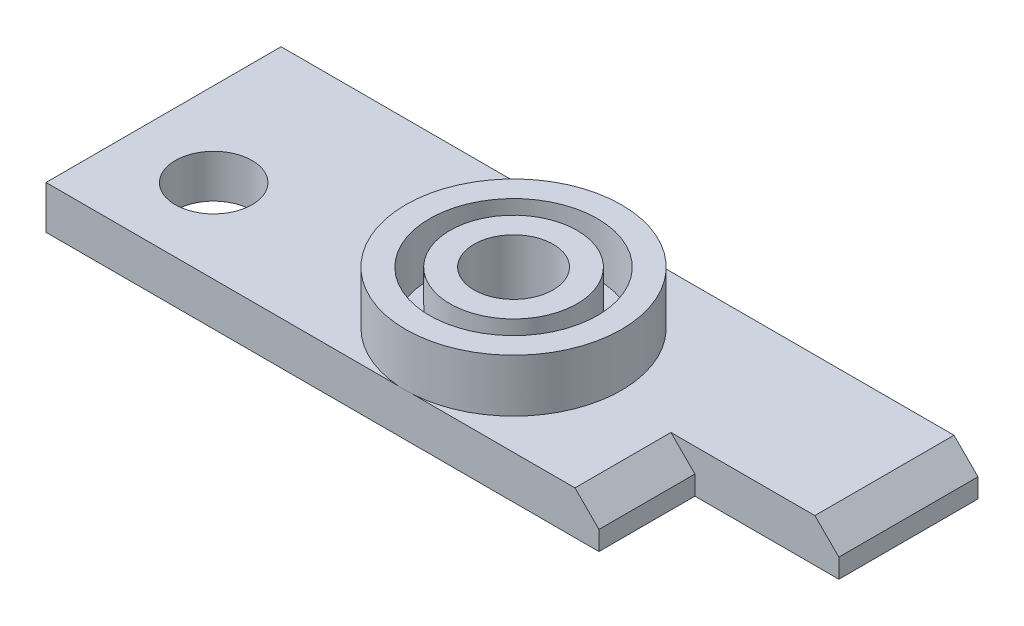
ISO-10303-21;
HEADER;
FILE_DESCRIPTION(('STEP AP214'),'2;1');
FILE_NAME('part.step','',(''),(''),'','','');
FILE_SCHEMA(('AUTOMOTIVE_DESIGN { 1 0 10303 214 1 1 1 1 }'));
ENDSEC;
DATA;
#1=APPLICATION_CONTEXT('core data for automotive mechanical design processes');
#2=APPLICATION_PROTOCOL_DEFINITION('international standard','automotive_design',2000,#1);
#3=PRODUCT_CONTEXT('',#1,'mechanical');
#4=PRODUCT('Part','Part','',(#3));
#5=PRODUCT_RELATED_PRODUCT_CATEGORY('part','',(#4));
#6=PRODUCT_DEFINITION_FORMATION('','',#4);
#7=PRODUCT_DEFINITION_CONTEXT('part definition',#1,'design');
#8=PRODUCT_DEFINITION('design','',#6,#7);
#9=PRODUCT_DEFINITION_SHAPE('','',#8);
#10=(LENGTH_UNIT() NAMED_UNIT(*) SI_UNIT(.MILLI.,.METRE.));
#11=(NAMED_UNIT(*) PLANE_ANGLE_UNIT() SI_UNIT($,.RADIAN.));
#12=(NAMED_UNIT(*) SI_UNIT($,.STERADIAN.) SOLID_ANGLE_UNIT());
#13=UNCERTAINTY_MEASURE_WITH_UNIT(LENGTH_MEASURE(1.E-05),#10,'distance_accuracy_value','');
#14=(GEOMETRIC_REPRESENTATION_CONTEXT(3) GLOBAL_UNCERTAINTY_ASSIGNED_CONTEXT((#13)) GLOBAL_UNIT_ASSIGNED_CONTEXT((#10,
#11,#12)) REPRESENTATION_CONTEXT('',''));
#15=CARTESIAN_POINT('',(0.,0.,0.));
#16=DIRECTION('',(0.,0.,1.));
#17=DIRECTION('',(1.,0.,0.));
#18=AXIS2_PLACEMENT_3D('',#15,#16,#17);
#19=CARTESIAN_POINT('',(0.,1.8,0.));
#20=DIRECTION('',(0.,1.,0.));
#21=DIRECTION('',(0.,0.,1.));
#22=AXIS2_PLACEMENT_3D('',#19,#20,#21);
#23=PLANE('',#22);
#24=CARTESIAN_POINT('',(14.9999999999999,1.8,-4.68975090072073));
#25=DIRECTION('',(0.,1.,0.));
#26=DIRECTION('',(0.,0.,1.));
#27=AXIS2_PLACEMENT_3D('',#24,#25,#26);
#28=CIRCLE('',#27,2.65000000000001);
#29=CARTESIAN_POINT('',(14.9999999999999,1.8,-2.03975090072073));
#30=VERTEX_POINT('',#29);
#31=EDGE_CURVE('E163',#30,#30,#28,.T.);
#32=ORIENTED_EDGE('',*,*,#31,.F.);
#33=EDGE_LOOP('',(#32));
#34=FACE_BOUND('',#33,.T.);
#35=CARTESIAN_POINT('',(14.9999999999999,1.8,-4.68975090072073));
#36=DIRECTION('',(0.,1.,0.));
#37=DIRECTION('',(0.,0.,1.));
#38=AXIS2_PLACEMENT_3D('',#35,#36,#37);
#39=CIRCLE('',#38,3.50000000000001);
#40=CARTESIAN_POINT('',(14.9999999999999,1.8,-1.18975090072073));
#41=VERTEX_POINT('',#40);
#42=EDGE_CURVE('E166',#41,#41,#39,.F.);
#43=ORIENTED_EDGE('',*,*,#42,.F.);
#44=EDGE_LOOP('',(#43));
#45=FACE_BOUND('',#44,.T.);
#46=ADVANCED_FACE('F43',(#34,#45),#23,.T.);
#47=CARTESIAN_POINT('',(29.05,1.8,-4.20000000000001));
#48=DIRECTION('',(0.,0.,-1.));
#49=DIRECTION('',(-1.,0.,0.));
#50=AXIS2_PLACEMENT_3D('',#47,#48,#49);
#51=PLANE('',#50);
#52=DIRECTION('',(0.,-1.,0.));
#53=VECTOR('',#52,1.);
#54=CARTESIAN_POINT('',(29.05,1.8,-4.20000000000001));
#55=LINE('',#54,#53);
#56=CARTESIAN_POINT('',(29.05,0.799999999999989,-4.20000000000001));
#57=VERTEX_POINT('',#56);
#58=CARTESIAN_POINT('',(29.05,0.,-4.20000000000001));
#59=VERTEX_POINT('',#58);
#60=EDGE_CURVE('E167',#57,#59,#55,.T.);
#61=ORIENTED_EDGE('',*,*,#60,.F.);
#62=DIRECTION('',(-0.707106781186545,0.70710678118655,0.));
#63=VECTOR('',#62,1.);
#64=CARTESIAN_POINT('',(28.05,1.8,-4.20000000000001));
#65=LINE('',#64,#63);
#66=CARTESIAN_POINT('',(28.05,1.8,-4.20000000000001));
#67=VERTEX_POINT('',#66);
#68=EDGE_CURVE('E52',#57,#67,#65,.T.);
#69=ORIENTED_EDGE('',*,*,#68,.T.);
#70=DIRECTION('',(1.,0.,0.));
#71=VECTOR('',#70,1.);
#72=CARTESIAN_POINT('',(29.05,1.8,-4.20000000000001));
#73=LINE('',#72,#71);
#74=CARTESIAN_POINT('',(22.05,1.8,-4.2));
#75=VERTEX_POINT('',#74);
#76=EDGE_CURVE('E149',#75,#67,#73,.T.);
#77=ORIENTED_EDGE('',*,*,#76,.F.);
#78=DIRECTION('',(0.707106781186545,-0.70710678118655,0.));
#79=VECTOR('',#78,1.);
#80=CARTESIAN_POINT('',(25.55,-1.7,-4.2));
#81=LINE('',#80,#79);
#82=CARTESIAN_POINT('',(23.05,0.799999999999989,-4.2));
#83=VERTEX_POINT('',#82);
#84=EDGE_CURVE('E11',#75,#83,#81,.T.);
#85=ORIENTED_EDGE('',*,*,#84,.T.);
#86=DIRECTION('',(0.,-1.,0.));
#87=VECTOR('',#86,1.);
#88=CARTESIAN_POINT('',(23.05,1.8,-4.2));
#89=LINE('',#88,#87);
#90=CARTESIAN_POINT('',(23.05,0.,-4.2));
#91=VERTEX_POINT('',#90);
#92=EDGE_CURVE('E141',#83,#91,#89,.T.);
#93=ORIENTED_EDGE('',*,*,#92,.T.);
#94=DIRECTION('',(1.,0.,0.));
#95=VECTOR('',#94,1.);
#96=CARTESIAN_POINT('',(29.05,0.,-4.20000000000001));
#97=LINE('',#96,#95);
#98=EDGE_CURVE('E162',#91,#59,#97,.T.);
#99=ORIENTED_EDGE('',*,*,#98,.T.);
#100=EDGE_LOOP('',(#61,#69,#77,#85,#93,#99));
#101=FACE_BOUND('',#100,.T.);
#102=ADVANCED_FACE('F198',(#101),#51,.F.);
#103=CARTESIAN_POINT('',(29.05,1.8,-4.20000000000001));
#104=DIRECTION('',(-1.,0.,0.));
#105=DIRECTION('',(0.,0.,1.));
#106=AXIS2_PLACEMENT_3D('',#103,#104,#105);
#107=PLANE('',#106);
#108=DIRECTION('',(0.,-1.,0.));
#109=VECTOR('',#108,1.);
#110=CARTESIAN_POINT('',(29.05,1.8,-10.));
#111=LINE('',#110,#109);
#112=CARTESIAN_POINT('',(29.05,0.799999999999989,-10.));
#113=VERTEX_POINT('',#112);
#114=CARTESIAN_POINT('',(29.05,0.,-10.));
#115=VERTEX_POINT('',#114);
#116=EDGE_CURVE('E258',#113,#115,#111,.T.);
#117=ORIENTED_EDGE('',*,*,#116,.F.);
#118=DIRECTION('',(0.,0.,1.));
#119=VECTOR('',#118,1.);
#120=CARTESIAN_POINT('',(29.05,0.799999999999989,-4.20000000000001));
#121=LINE('',#120,#119);
#122=EDGE_CURVE('E59',#113,#57,#121,.T.);
#123=ORIENTED_EDGE('',*,*,#122,.T.);
#124=ORIENTED_EDGE('',*,*,#60,.T.);
#125=DIRECTION('',(0.,0.,-1.));
#126=VECTOR('',#125,1.);
#127=CARTESIAN_POINT('',(29.05,0.,-4.20000000000001));
#128=LINE('',#127,#126);
#129=EDGE_CURVE('E240',#59,#115,#128,.T.);
#130=ORIENTED_EDGE('',*,*,#129,.T.);
#131=EDGE_LOOP('',(#117,#123,#124,#130));
#132=FACE_BOUND('',#131,.T.);
#133=ADVANCED_FACE('F205',(#132),#107,.F.);
#134=CARTESIAN_POINT('',(0.,1.8,-10.));
#135=DIRECTION('',(0.,0.,1.));
#136=DIRECTION('',(1.,0.,0.));
#137=AXIS2_PLACEMENT_3D('',#134,#135,#136);
#138=PLANE('',#137);
#139=DIRECTION('',(-1.,0.,0.));
#140=VECTOR('',#139,1.);
#141=CARTESIAN_POINT('',(0.,1.8,-10.));
#142=LINE('',#141,#140);
#143=CARTESIAN_POINT('',(28.05,1.8,-10.));
#144=VERTEX_POINT('',#143);
#145=CARTESIAN_POINT('',(0.,1.8,-10.));
#146=VERTEX_POINT('',#145);
#147=EDGE_CURVE('E148',#144,#146,#142,.T.);
#148=ORIENTED_EDGE('',*,*,#147,.F.);
#149=DIRECTION('',(0.707106781186545,-0.70710678118655,0.));
#150=VECTOR('',#149,1.);
#151=CARTESIAN_POINT('',(28.05,1.8,-10.));
#152=LINE('',#151,#150);
#153=EDGE_CURVE('E67',#144,#113,#152,.T.);
#154=ORIENTED_EDGE('',*,*,#153,.T.);
#155=ORIENTED_EDGE('',*,*,#116,.T.);
#156=DIRECTION('',(-1.,0.,0.));
#157=VECTOR('',#156,1.);
#158=CARTESIAN_POINT('',(0.,0.,-10.));
#159=LINE('',#158,#157);
#160=CARTESIAN_POINT('',(0.,0.,-10.));
#161=VERTEX_POINT('',#160);
#162=EDGE_CURVE('E241',#115,#161,#159,.T.);
#163=ORIENTED_EDGE('',*,*,#162,.T.);
#164=DIRECTION('',(0.,-1.,0.));
#165=VECTOR('',#164,1.);
#166=CARTESIAN_POINT('',(0.,1.8,-10.));
#167=LINE('',#166,#165);
#168=EDGE_CURVE('E255',#146,#161,#167,.T.);
#169=ORIENTED_EDGE('',*,*,#168,.F.);
#170=EDGE_LOOP('',(#148,#154,#155,#163,#169));
#171=FACE_BOUND('',#170,.T.);
#172=ADVANCED_FACE('F383',(#171),#138,.F.);
#173=CARTESIAN_POINT('',(0.,1.8,-4.2));
#174=DIRECTION('',(1.,0.,0.));
#175=DIRECTION('',(0.,0.,-1.));
#176=AXIS2_PLACEMENT_3D('',#173,#174,#175);
#177=PLANE('',#176);
#178=DIRECTION('',(0.,0.,1.));
#179=VECTOR('',#178,1.);
#180=CARTESIAN_POINT('',(0.,0.,-4.2));
#181=LINE('',#180,#179);
#182=CARTESIAN_POINT('',(0.,0.,-0.200000000000003));
#183=VERTEX_POINT('',#182);
#184=EDGE_CURVE('E246',#161,#183,#181,.T.);
#185=ORIENTED_EDGE('',*,*,#184,.T.);
#186=DIRECTION('',(0.,-1.,0.));
#187=VECTOR('',#186,1.);
#188=CARTESIAN_POINT('',(0.,1.8,-0.200000000000003));
#189=LINE('',#188,#187);
#190=CARTESIAN_POINT('',(0.,1.8,-0.200000000000003));
#191=VERTEX_POINT('',#190);
#192=EDGE_CURVE('E253',#191,#183,#189,.T.);
#193=ORIENTED_EDGE('',*,*,#192,.F.);
#194=DIRECTION('',(0.,0.,1.));
#195=VECTOR('',#194,1.);
#196=CARTESIAN_POINT('',(0.,1.8,-4.2));
#197=LINE('',#196,#195);
#198=EDGE_CURVE('E139',#146,#191,#197,.T.);
#199=ORIENTED_EDGE('',*,*,#198,.F.);
#200=ORIENTED_EDGE('',*,*,#168,.T.);
#201=EDGE_LOOP('',(#185,#193,#199,#200));
#202=FACE_BOUND('',#201,.T.);
#203=ADVANCED_FACE('F374',(#202),#177,.F.);
#204=CARTESIAN_POINT('',(0.,1.8,-0.200000000000003));
#205=DIRECTION('',(0.,0.,-1.));
#206=DIRECTION('',(-1.,0.,0.));
#207=AXIS2_PLACEMENT_3D('',#204,#205,#206);
#208=PLANE('',#207);
#209=DIRECTION('',(0.,-1.,0.));
#210=VECTOR('',#209,1.);
#211=CARTESIAN_POINT('',(23.05,1.8,-0.200000000000003));
#212=LINE('',#211,#210);
#213=CARTESIAN_POINT('',(23.05,0.799999999999989,-0.200000000000003));
#214=VERTEX_POINT('',#213);
#215=CARTESIAN_POINT('',(23.05,0.,-0.200000000000003));
#216=VERTEX_POINT('',#215);
#217=EDGE_CURVE('E142',#214,#216,#212,.T.);
#218=ORIENTED_EDGE('',*,*,#217,.F.);
#219=DIRECTION('',(-0.707106781186545,0.70710678118655,0.));
#220=VECTOR('',#219,1.);
#221=CARTESIAN_POINT('',(22.05,1.8,-0.200000000000003));
#222=LINE('',#221,#220);
#223=CARTESIAN_POINT('',(22.05,1.8,-0.200000000000003));
#224=VERTEX_POINT('',#223);
#225=EDGE_CURVE('E270',#214,#224,#222,.T.);
#226=ORIENTED_EDGE('',*,*,#225,.T.);
#227=DIRECTION('',(1.,0.,0.));
#228=VECTOR('',#227,1.);
#229=CARTESIAN_POINT('',(0.,1.8,-0.200000000000003));
#230=LINE('',#229,#228);
#231=CARTESIAN_POINT('',(15.3035405236166,1.8,-0.200000000000003));
#232=VERTEX_POINT('',#231);
#233=EDGE_CURVE('E135',#232,#224,#230,.T.);
#234=ORIENTED_EDGE('',*,*,#233,.F.);
#235=CARTESIAN_POINT('',(14.6964594763833,1.8,-0.200000000000003));
#236=VERTEX_POINT('',#235);
#237=EDGE_CURVE('E117',#236,#232,#230,.T.);
#238=ORIENTED_EDGE('',*,*,#237,.F.);
#239=EDGE_CURVE('E134',#191,#236,#230,.T.);
#240=ORIENTED_EDGE('',*,*,#239,.F.);
#241=ORIENTED_EDGE('',*,*,#192,.T.);
#242=DIRECTION('',(1.,0.,0.));
#243=VECTOR('',#242,1.);
#244=CARTESIAN_POINT('',(0.,0.,-0.200000000000003));
#245=LINE('',#244,#243);
#246=EDGE_CURVE('E248',#183,#216,#245,.T.);
#247=ORIENTED_EDGE('',*,*,#246,.T.);
#248=EDGE_LOOP('',(#218,#226,#234,#238,#240,#241,#247));
#249=FACE_BOUND('',#248,.T.);
#250=ADVANCED_FACE('F132',(#249),#208,.F.);
#251=CARTESIAN_POINT('',(23.05,1.8,-4.2));
#252=DIRECTION('',(-1.,0.,0.));
#253=DIRECTION('',(0.,0.,1.));
#254=AXIS2_PLACEMENT_3D('',#251,#252,#253);
#255=PLANE('',#254);
#256=ORIENTED_EDGE('',*,*,#92,.F.);
#257=DIRECTION('',(0.,0.,1.));
#258=VECTOR('',#257,1.);
#259=CARTESIAN_POINT('',(23.05,0.799999999999989,-0.200000000000003));
#260=LINE('',#259,#258);
#261=EDGE_CURVE('E268',#83,#214,#260,.T.);
#262=ORIENTED_EDGE('',*,*,#261,.T.);
#263=ORIENTED_EDGE('',*,*,#217,.T.);
#264=DIRECTION('',(0.,0.,-1.));
#265=VECTOR('',#264,1.);
#266=CARTESIAN_POINT('',(23.05,0.,-4.2));
#267=LINE('',#266,#265);
#268=EDGE_CURVE('E154',#216,#91,#267,.T.);
#269=ORIENTED_EDGE('',*,*,#268,.T.);
#270=EDGE_LOOP('',(#256,#262,#263,#269));
#271=FACE_BOUND('',#270,.T.);
#272=ADVANCED_FACE('F214',(#271),#255,.F.);
#273=CARTESIAN_POINT('',(3.5,1.8,-3.68975090072078));
#274=DIRECTION('',(0.,-1.,0.));
#275=DIRECTION('',(0.,0.,-1.));
#276=AXIS2_PLACEMENT_3D('',#273,#274,#275);
#277=CIRCLE('',#276,1.6);
#278=CARTESIAN_POINT('',(3.5,1.8,-5.28975090072078));
#279=VERTEX_POINT('',#278);
#280=EDGE_CURVE('E158',#279,#279,#277,.T.);
#281=ORIENTED_EDGE('',*,*,#280,.T.);
#282=EDGE_LOOP('',(#281));
#283=FACE_BOUND('',#282,.T.);
#284=ORIENTED_EDGE('',*,*,#233,.T.);
#285=DIRECTION('',(0.,0.,-1.));
#286=VECTOR('',#285,1.);
#287=CARTESIAN_POINT('',(22.05,1.8,-4.2));
#288=LINE('',#287,#286);
#289=EDGE_CURVE('E266',#224,#75,#288,.T.);
#290=ORIENTED_EDGE('',*,*,#289,.T.);
#291=ORIENTED_EDGE('',*,*,#76,.T.);
#292=DIRECTION('',(0.,0.,-1.));
#293=VECTOR('',#292,1.);
#294=CARTESIAN_POINT('',(28.05,1.8,-10.));
#295=LINE('',#294,#293);
#296=EDGE_CURVE('E263',#67,#144,#295,.T.);
#297=ORIENTED_EDGE('',*,*,#296,.T.);
#298=ORIENTED_EDGE('',*,*,#147,.T.);
#299=ORIENTED_EDGE('',*,*,#198,.T.);
#300=ORIENTED_EDGE('',*,*,#239,.T.);
#301=CARTESIAN_POINT('',(14.9999999999999,1.8,-4.68975090072073));
#302=DIRECTION('',(0.,1.,0.));
#303=DIRECTION('',(0.,0.,1.));
#304=AXIS2_PLACEMENT_3D('',#301,#302,#303);
#305=CIRCLE('',#304,4.50000000000001);
#306=EDGE_CURVE('E120',#232,#236,#305,.T.);
#307=ORIENTED_EDGE('',*,*,#306,.F.);
#308=EDGE_LOOP('',(#284,#290,#291,#297,#298,#299,#300,#307));
#309=FACE_BOUND('',#308,.T.);
#310=ADVANCED_FACE('F137',(#283,#309),#23,.T.);
#311=CARTESIAN_POINT('',(0.,0.,0.));
#312=DIRECTION('',(0.,1.,0.));
#313=DIRECTION('',(0.,0.,1.));
#314=AXIS2_PLACEMENT_3D('',#311,#312,#313);
#315=PLANE('',#314);
#316=CARTESIAN_POINT('',(14.9999999999999,0.,-4.68975090072073));
#317=DIRECTION('',(0.,1.,0.));
#318=DIRECTION('',(0.,0.,1.));
#319=AXIS2_PLACEMENT_3D('',#316,#317,#318);
#320=CIRCLE('',#319,1.65000000000001);
#321=CARTESIAN_POINT('',(14.9999999999999,0.,-3.03975090072073));
#322=VERTEX_POINT('',#321);
#323=EDGE_CURVE('E170',#322,#322,#320,.T.);
#324=ORIENTED_EDGE('',*,*,#323,.T.);
#325=EDGE_LOOP('',(#324));
#326=FACE_BOUND('',#325,.T.);
#327=CARTESIAN_POINT('',(3.5,0.,-3.68975090072078));
#328=DIRECTION('',(0.,-1.,0.));
#329=DIRECTION('',(0.,0.,-1.));
#330=AXIS2_PLACEMENT_3D('',#327,#328,#329);
#331=CIRCLE('',#330,1.6);
#332=CARTESIAN_POINT('',(3.5,0.,-5.28975090072078));
#333=VERTEX_POINT('',#332);
#334=EDGE_CURVE('E155',#333,#333,#331,.T.);
#335=ORIENTED_EDGE('',*,*,#334,.F.);
#336=EDGE_LOOP('',(#335));
#337=FACE_BOUND('',#336,.T.);
#338=ORIENTED_EDGE('',*,*,#98,.F.);
#339=ORIENTED_EDGE('',*,*,#268,.F.);
#340=ORIENTED_EDGE('',*,*,#246,.F.);
#341=ORIENTED_EDGE('',*,*,#184,.F.);
#342=ORIENTED_EDGE('',*,*,#162,.F.);
#343=ORIENTED_EDGE('',*,*,#129,.F.);
#344=EDGE_LOOP('',(#338,#339,#340,#341,#342,#343));
#345=FACE_BOUND('',#344,.T.);
#346=ADVANCED_FACE('F213',(#326,#337,#345),#315,.F.);
#347=CARTESIAN_POINT('',(3.5,1.8,-3.68975090072078));
#348=DIRECTION('',(0.,-1.,0.));
#349=DIRECTION('',(0.,0.,-1.));
#350=AXIS2_PLACEMENT_3D('',#347,#348,#349);
#351=CYLINDRICAL_SURFACE('',#350,1.6);
#352=ORIENTED_EDGE('',*,*,#280,.F.);
#353=EDGE_LOOP('',(#352));
#354=FACE_BOUND('',#353,.T.);
#355=ORIENTED_EDGE('',*,*,#334,.T.);
#356=EDGE_LOOP('',(#355));
#357=FACE_BOUND('',#356,.T.);
#358=ADVANCED_FACE('F220',(#354,#357),#351,.F.);
#359=CARTESIAN_POINT('',(14.9999999999999,4.,-4.68975090072073));
#360=DIRECTION('',(0.,-1.,0.));
#361=DIRECTION('',(0.,0.,-1.));
#362=AXIS2_PLACEMENT_3D('',#359,#360,#361);
#363=CYLINDRICAL_SURFACE('',#362,2.65000000000001);
#364=ORIENTED_EDGE('',*,*,#31,.T.);
#365=EDGE_LOOP('',(#364));
#366=FACE_BOUND('',#365,.T.);
#367=CARTESIAN_POINT('',(14.9999999999999,4.,-4.68975090072073));
#368=DIRECTION('',(0.,-1.,0.));
#369=DIRECTION('',(0.,0.,-1.));
#370=AXIS2_PLACEMENT_3D('',#367,#368,#369);
#371=CIRCLE('',#370,2.65000000000001);
#372=CARTESIAN_POINT('',(14.9999999999999,4.,-7.33975090072074));
#373=VERTEX_POINT('',#372);
#374=EDGE_CURVE('E159',#373,#373,#371,.T.);
#375=ORIENTED_EDGE('',*,*,#374,.T.);
#376=EDGE_LOOP('',(#375));
#377=FACE_BOUND('',#376,.T.);
#378=ADVANCED_FACE('F228',(#366,#377),#363,.T.);
#379=CARTESIAN_POINT('',(14.9999999999999,4.,-4.68975090072073));
#380=DIRECTION('',(0.,-1.,0.));
#381=DIRECTION('',(0.,0.,-1.));
#382=AXIS2_PLACEMENT_3D('',#379,#380,#381);
#383=PLANE('',#382);
#384=CARTESIAN_POINT('',(14.9999999999999,4.,-4.68975090072073));
#385=DIRECTION('',(0.,1.,0.));
#386=DIRECTION('',(0.,0.,1.));
#387=AXIS2_PLACEMENT_3D('',#384,#385,#386);
#388=CIRCLE('',#387,1.65000000000001);
#389=CARTESIAN_POINT('',(14.9999999999999,4.,-3.03975090072073));
#390=VERTEX_POINT('',#389);
#391=EDGE_CURVE('E171',#390,#390,#388,.T.);
#392=ORIENTED_EDGE('',*,*,#391,.F.);
#393=EDGE_LOOP('',(#392));
#394=FACE_BOUND('',#393,.T.);
#395=ORIENTED_EDGE('',*,*,#374,.F.);
#396=EDGE_LOOP('',(#395));
#397=FACE_BOUND('',#396,.T.);
#398=ADVANCED_FACE('F324',(#394,#397),#383,.F.);
#399=CARTESIAN_POINT('',(14.9999999999999,0.,-4.68975090072073));
#400=DIRECTION('',(0.,1.,0.));
#401=DIRECTION('',(0.,0.,1.));
#402=AXIS2_PLACEMENT_3D('',#399,#400,#401);
#403=CYLINDRICAL_SURFACE('',#402,1.65000000000001);
#404=ORIENTED_EDGE('',*,*,#323,.F.);
#405=EDGE_LOOP('',(#404));
#406=FACE_BOUND('',#405,.T.);
#407=ORIENTED_EDGE('',*,*,#391,.T.);
#408=EDGE_LOOP('',(#407));
#409=FACE_BOUND('',#408,.T.);
#410=ADVANCED_FACE('F312',(#406,#409),#403,.F.);
#411=CARTESIAN_POINT('',(14.9999999999999,1.8,-4.68975090072073));
#412=DIRECTION('',(0.,1.,0.));
#413=DIRECTION('',(0.,0.,1.));
#414=AXIS2_PLACEMENT_3D('',#411,#412,#413);
#415=PLANE('',#414);
#416=EDGE_CURVE('E113',#236,#232,#305,.T.);
#417=ORIENTED_EDGE('',*,*,#416,.F.);
#418=ORIENTED_EDGE('',*,*,#237,.T.);
#419=EDGE_LOOP('',(#417,#418));
#420=FACE_BOUND('',#419,.T.);
#421=ADVANCED_FACE('F115',(#420),#415,.F.);
#422=CARTESIAN_POINT('',(14.9999999999999,16.7279220613579,-4.68975090072073));
#423=DIRECTION('',(0.,-1.,0.));
#424=DIRECTION('',(0.,0.,-1.));
#425=AXIS2_PLACEMENT_3D('',#422,#423,#424);
#426=CYLINDRICAL_SURFACE('',#425,4.50000000000001);
#427=CARTESIAN_POINT('',(14.9999999999999,4.,-4.68975090072073));
#428=DIRECTION('',(0.,-1.,0.));
#429=DIRECTION('',(0.,0.,-1.));
#430=AXIS2_PLACEMENT_3D('',#427,#428,#429);
#431=CIRCLE('',#430,4.50000000000001);
#432=CARTESIAN_POINT('',(14.9999999999999,4.,-9.18975090072074));
#433=VERTEX_POINT('',#432);
#434=EDGE_CURVE('E121',#433,#433,#431,.T.);
#435=ORIENTED_EDGE('',*,*,#434,.T.);
#436=EDGE_LOOP('',(#435));
#437=FACE_BOUND('',#436,.T.);
#438=ORIENTED_EDGE('',*,*,#306,.T.);
#439=ORIENTED_EDGE('',*,*,#416,.T.);
#440=EDGE_LOOP('',(#438,#439));
#441=FACE_BOUND('',#440,.T.);
#442=ADVANCED_FACE('F123',(#437,#441),#426,.T.);
#443=CARTESIAN_POINT('',(14.9999999999999,16.7279220613579,-4.68975090072073));
#444=DIRECTION('',(0.,-1.,0.));
#445=DIRECTION('',(0.,0.,-1.));
#446=AXIS2_PLACEMENT_3D('',#443,#444,#445);
#447=CYLINDRICAL_SURFACE('',#446,3.50000000000001);
#448=CARTESIAN_POINT('',(14.9999999999999,4.,-4.68975090072073));
#449=DIRECTION('',(0.,-1.,0.));
#450=DIRECTION('',(0.,0.,-1.));
#451=AXIS2_PLACEMENT_3D('',#448,#449,#450);
#452=CIRCLE('',#451,3.50000000000001);
#453=CARTESIAN_POINT('',(14.9999999999999,4.,-8.18975090072074));
#454=VERTEX_POINT('',#453);
#455=EDGE_CURVE('E128',#454,#454,#452,.T.);
#456=ORIENTED_EDGE('',*,*,#455,.F.);
#457=EDGE_LOOP('',(#456));
#458=FACE_BOUND('',#457,.T.);
#459=ORIENTED_EDGE('',*,*,#42,.T.);
#460=EDGE_LOOP('',(#459));
#461=FACE_BOUND('',#460,.T.);
#462=ADVANCED_FACE('F185',(#458,#461),#447,.F.);
#463=CARTESIAN_POINT('',(14.9999999999999,4.,-4.68975090072073));
#464=DIRECTION('',(0.,-1.,0.));
#465=DIRECTION('',(0.,0.,-1.));
#466=AXIS2_PLACEMENT_3D('',#463,#464,#465);
#467=PLANE('',#466);
#468=ORIENTED_EDGE('',*,*,#455,.T.);
#469=EDGE_LOOP('',(#468));
#470=FACE_BOUND('',#469,.T.);
#471=ORIENTED_EDGE('',*,*,#434,.F.);
#472=EDGE_LOOP('',(#471));
#473=FACE_BOUND('',#472,.T.);
#474=ADVANCED_FACE('F182',(#470,#473),#467,.F.);
#475=CARTESIAN_POINT('',(22.05,1.8,0.));
#476=DIRECTION('',(0.70710678118655,0.707106781186545,0.));
#477=DIRECTION('',(0.,0.,1.));
#478=AXIS2_PLACEMENT_3D('',#475,#476,#477);
#479=PLANE('',#478);
#480=ORIENTED_EDGE('',*,*,#225,.F.);
#481=ORIENTED_EDGE('',*,*,#261,.F.);
#482=ORIENTED_EDGE('',*,*,#84,.F.);
#483=ORIENTED_EDGE('',*,*,#289,.F.);
#484=EDGE_LOOP('',(#480,#481,#482,#483));
#485=FACE_BOUND('',#484,.T.);
#486=ADVANCED_FACE('F184',(#485),#479,.T.);
#487=CARTESIAN_POINT('',(28.05,1.8,0.));
#488=DIRECTION('',(0.70710678118655,0.707106781186545,0.));
#489=DIRECTION('',(0.,0.,1.));
#490=AXIS2_PLACEMENT_3D('',#487,#488,#489);
#491=PLANE('',#490);
#492=ORIENTED_EDGE('',*,*,#68,.F.);
#493=ORIENTED_EDGE('',*,*,#122,.F.);
#494=ORIENTED_EDGE('',*,*,#153,.F.);
#495=ORIENTED_EDGE('',*,*,#296,.F.);
#496=EDGE_LOOP('',(#492,#493,#494,#495));
#497=FACE_BOUND('',#496,.T.);
#498=ADVANCED_FACE('F46',(#497),#491,.T.);
#499=CLOSED_SHELL('',(#46,#102,#133,#172,#203,#250,#272,#310,#346,#358,#378,#398,#410,#421,#442,
#462,#474,#486,#498));
#500=MANIFOLD_SOLID_BREP('B2',#499);
#501=ADVANCED_BREP_SHAPE_REPRESENTATION('',(#18,#500),#14);
#502=SHAPE_DEFINITION_REPRESENTATION(#9,#501);
ENDSEC;
END-ISO-10303-21;
